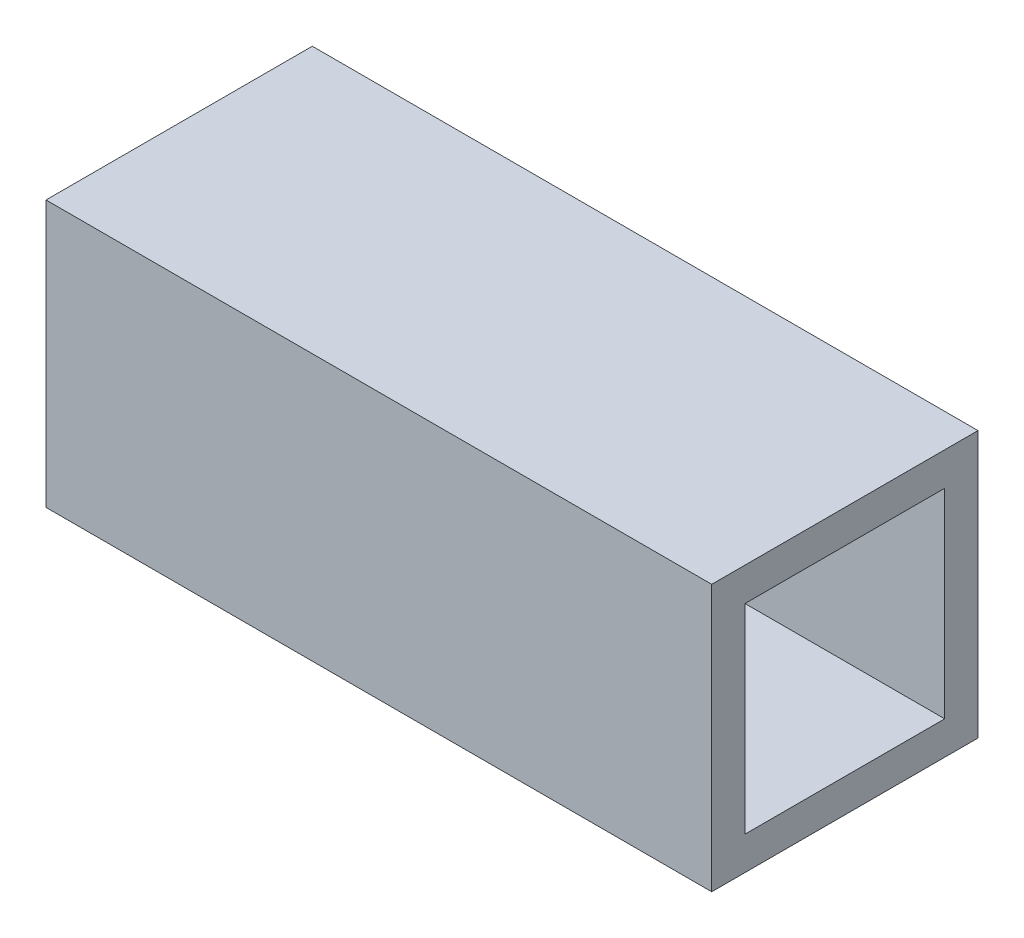
ISO-10303-21;
HEADER;
FILE_DESCRIPTION(('STEP AP214'),'2;1');
FILE_NAME('part.step','',(''),(''),'','','');
FILE_SCHEMA(('AUTOMOTIVE_DESIGN { 1 0 10303 214 1 1 1 1 }'));
ENDSEC;
DATA;
#1=APPLICATION_CONTEXT('core data for automotive mechanical design processes');
#2=APPLICATION_PROTOCOL_DEFINITION('international standard','automotive_design',2000,#1);
#3=PRODUCT_CONTEXT('',#1,'mechanical');
#4=PRODUCT('Part','Part','',(#3));
#5=PRODUCT_RELATED_PRODUCT_CATEGORY('part','',(#4));
#6=PRODUCT_DEFINITION_FORMATION('','',#4);
#7=PRODUCT_DEFINITION_CONTEXT('part definition',#1,'design');
#8=PRODUCT_DEFINITION('design','',#6,#7);
#9=PRODUCT_DEFINITION_SHAPE('','',#8);
#10=(LENGTH_UNIT() NAMED_UNIT(*) SI_UNIT(.MILLI.,.METRE.));
#11=(NAMED_UNIT(*) PLANE_ANGLE_UNIT() SI_UNIT($,.RADIAN.));
#12=(NAMED_UNIT(*) SI_UNIT($,.STERADIAN.) SOLID_ANGLE_UNIT());
#13=UNCERTAINTY_MEASURE_WITH_UNIT(LENGTH_MEASURE(1.E-05),#10,'distance_accuracy_value','');
#14=(GEOMETRIC_REPRESENTATION_CONTEXT(3) GLOBAL_UNCERTAINTY_ASSIGNED_CONTEXT((#13)) GLOBAL_UNIT_ASSIGNED_CONTEXT((#10,
#11,#12)) REPRESENTATION_CONTEXT('',''));
#15=CARTESIAN_POINT('',(0.,0.,0.));
#16=DIRECTION('',(0.,0.,1.));
#17=DIRECTION('',(1.,0.,0.));
#18=AXIS2_PLACEMENT_3D('',#15,#16,#17);
#19=CARTESIAN_POINT('',(0.,-19.05,-19.05));
#20=DIRECTION('',(0.,1.,0.));
#21=DIRECTION('',(0.,0.,1.));
#22=AXIS2_PLACEMENT_3D('',#19,#20,#21);
#23=PLANE('',#22);
#24=DIRECTION('',(0.,0.,-1.));
#25=VECTOR('',#24,1.);
#26=CARTESIAN_POINT('',(127.,-19.05,0.));
#27=LINE('',#26,#25);
#28=CARTESIAN_POINT('',(127.,-19.05,-19.05));
#29=VERTEX_POINT('',#28);
#30=CARTESIAN_POINT('',(127.,-19.05,19.05));
#31=VERTEX_POINT('',#30);
#32=EDGE_CURVE('E121',#29,#31,#27,.F.);
#33=ORIENTED_EDGE('',*,*,#32,.F.);
#34=DIRECTION('',(1.,0.,0.));
#35=VECTOR('',#34,1.);
#36=CARTESIAN_POINT('',(0.,-19.05,-19.05));
#37=LINE('',#36,#35);
#38=CARTESIAN_POINT('',(0.,-19.05,-19.05));
#39=VERTEX_POINT('',#38);
#40=EDGE_CURVE('E97',#39,#29,#37,.T.);
#41=ORIENTED_EDGE('',*,*,#40,.F.);
#42=DIRECTION('',(0.,0.,-1.));
#43=VECTOR('',#42,1.);
#44=CARTESIAN_POINT('',(0.,-19.05,0.));
#45=LINE('',#44,#43);
#46=CARTESIAN_POINT('',(0.,-19.05,19.05));
#47=VERTEX_POINT('',#46);
#48=EDGE_CURVE('E104',#39,#47,#45,.F.);
#49=ORIENTED_EDGE('',*,*,#48,.T.);
#50=DIRECTION('',(-1.,0.,0.));
#51=VECTOR('',#50,1.);
#52=CARTESIAN_POINT('',(0.,-19.05,19.05));
#53=LINE('',#52,#51);
#54=EDGE_CURVE('E19',#31,#47,#53,.T.);
#55=ORIENTED_EDGE('',*,*,#54,.F.);
#56=EDGE_LOOP('',(#33,#41,#49,#55));
#57=FACE_BOUND('',#56,.T.);
#58=ADVANCED_FACE('F16',(#57),#23,.T.);
#59=CARTESIAN_POINT('',(0.,-19.05,19.05));
#60=DIRECTION('',(0.,0.,-1.));
#61=DIRECTION('',(-1.,0.,0.));
#62=AXIS2_PLACEMENT_3D('',#59,#60,#61);
#63=PLANE('',#62);
#64=DIRECTION('',(0.,1.,0.));
#65=VECTOR('',#64,1.);
#66=CARTESIAN_POINT('',(127.,0.,19.05));
#67=LINE('',#66,#65);
#68=CARTESIAN_POINT('',(127.,19.05,19.05));
#69=VERTEX_POINT('',#68);
#70=EDGE_CURVE('E126',#31,#69,#67,.T.);
#71=ORIENTED_EDGE('',*,*,#70,.F.);
#72=ORIENTED_EDGE('',*,*,#54,.T.);
#73=DIRECTION('',(0.,1.,0.));
#74=VECTOR('',#73,1.);
#75=CARTESIAN_POINT('',(0.,0.,19.05));
#76=LINE('',#75,#74);
#77=CARTESIAN_POINT('',(0.,19.05,19.05));
#78=VERTEX_POINT('',#77);
#79=EDGE_CURVE('E80',#47,#78,#76,.T.);
#80=ORIENTED_EDGE('',*,*,#79,.T.);
#81=DIRECTION('',(1.,0.,0.));
#82=VECTOR('',#81,1.);
#83=CARTESIAN_POINT('',(0.,19.05,19.05));
#84=LINE('',#83,#82);
#85=EDGE_CURVE('E83',#69,#78,#84,.F.);
#86=ORIENTED_EDGE('',*,*,#85,.F.);
#87=EDGE_LOOP('',(#71,#72,#80,#86));
#88=FACE_BOUND('',#87,.T.);
#89=ADVANCED_FACE('F82',(#88),#63,.T.);
#90=CARTESIAN_POINT('',(0.,19.05,19.05));
#91=DIRECTION('',(0.,-1.,0.));
#92=DIRECTION('',(0.,0.,-1.));
#93=AXIS2_PLACEMENT_3D('',#90,#91,#92);
#94=PLANE('',#93);
#95=DIRECTION('',(0.,0.,-1.));
#96=VECTOR('',#95,1.);
#97=CARTESIAN_POINT('',(127.,19.05,0.));
#98=LINE('',#97,#96);
#99=CARTESIAN_POINT('',(127.,19.05,-19.05));
#100=VERTEX_POINT('',#99);
#101=EDGE_CURVE('E95',#69,#100,#98,.T.);
#102=ORIENTED_EDGE('',*,*,#101,.F.);
#103=ORIENTED_EDGE('',*,*,#85,.T.);
#104=DIRECTION('',(0.,0.,-1.));
#105=VECTOR('',#104,1.);
#106=CARTESIAN_POINT('',(0.,19.05,0.));
#107=LINE('',#106,#105);
#108=CARTESIAN_POINT('',(0.,19.05,-19.05));
#109=VERTEX_POINT('',#108);
#110=EDGE_CURVE('E88',#78,#109,#107,.T.);
#111=ORIENTED_EDGE('',*,*,#110,.T.);
#112=DIRECTION('',(1.,0.,0.));
#113=VECTOR('',#112,1.);
#114=CARTESIAN_POINT('',(0.,19.05,-19.05));
#115=LINE('',#114,#113);
#116=EDGE_CURVE('E109',#100,#109,#115,.F.);
#117=ORIENTED_EDGE('',*,*,#116,.F.);
#118=EDGE_LOOP('',(#102,#103,#111,#117));
#119=FACE_BOUND('',#118,.T.);
#120=ADVANCED_FACE('F92',(#119),#94,.T.);
#121=CARTESIAN_POINT('',(0.,19.05,-19.05));
#122=DIRECTION('',(0.,0.,1.));
#123=DIRECTION('',(1.,0.,0.));
#124=AXIS2_PLACEMENT_3D('',#121,#122,#123);
#125=PLANE('',#124);
#126=DIRECTION('',(0.,1.,0.));
#127=VECTOR('',#126,1.);
#128=CARTESIAN_POINT('',(127.,0.,-19.05));
#129=LINE('',#128,#127);
#130=EDGE_CURVE('E116',#100,#29,#129,.F.);
#131=ORIENTED_EDGE('',*,*,#130,.F.);
#132=ORIENTED_EDGE('',*,*,#116,.T.);
#133=DIRECTION('',(0.,1.,0.));
#134=VECTOR('',#133,1.);
#135=CARTESIAN_POINT('',(0.,0.,-19.05));
#136=LINE('',#135,#134);
#137=EDGE_CURVE('E102',#109,#39,#136,.F.);
#138=ORIENTED_EDGE('',*,*,#137,.T.);
#139=ORIENTED_EDGE('',*,*,#40,.T.);
#140=EDGE_LOOP('',(#131,#132,#138,#139));
#141=FACE_BOUND('',#140,.T.);
#142=ADVANCED_FACE('F115',(#141),#125,.T.);
#143=CARTESIAN_POINT('',(0.,-25.4,-25.4));
#144=DIRECTION('',(0.,0.,-1.));
#145=DIRECTION('',(-1.,0.,0.));
#146=AXIS2_PLACEMENT_3D('',#143,#144,#145);
#147=PLANE('',#146);
#148=DIRECTION('',(0.,1.,0.));
#149=VECTOR('',#148,1.);
#150=CARTESIAN_POINT('',(127.,0.,-25.4));
#151=LINE('',#150,#149);
#152=CARTESIAN_POINT('',(127.,-25.4,-25.4));
#153=VERTEX_POINT('',#152);
#154=CARTESIAN_POINT('',(127.,25.4,-25.4));
#155=VERTEX_POINT('',#154);
#156=EDGE_CURVE('E132',#153,#155,#151,.T.);
#157=ORIENTED_EDGE('',*,*,#156,.F.);
#158=DIRECTION('',(1.,0.,0.));
#159=VECTOR('',#158,1.);
#160=CARTESIAN_POINT('',(0.,-25.4,-25.4));
#161=LINE('',#160,#159);
#162=CARTESIAN_POINT('',(0.,-25.4,-25.4));
#163=VERTEX_POINT('',#162);
#164=EDGE_CURVE('E137',#163,#153,#161,.T.);
#165=ORIENTED_EDGE('',*,*,#164,.F.);
#166=DIRECTION('',(0.,1.,0.));
#167=VECTOR('',#166,1.);
#168=CARTESIAN_POINT('',(0.,0.,-25.4));
#169=LINE('',#168,#167);
#170=CARTESIAN_POINT('',(0.,25.4,-25.4));
#171=VERTEX_POINT('',#170);
#172=EDGE_CURVE('E89',#163,#171,#169,.T.);
#173=ORIENTED_EDGE('',*,*,#172,.T.);
#174=DIRECTION('',(1.,0.,0.));
#175=VECTOR('',#174,1.);
#176=CARTESIAN_POINT('',(0.,25.4,-25.4));
#177=LINE('',#176,#175);
#178=EDGE_CURVE('E240',#155,#171,#177,.F.);
#179=ORIENTED_EDGE('',*,*,#178,.F.);
#180=EDGE_LOOP('',(#157,#165,#173,#179));
#181=FACE_BOUND('',#180,.T.);
#182=ADVANCED_FACE('F166',(#181),#147,.T.);
#183=CARTESIAN_POINT('',(0.,0.,0.));
#184=DIRECTION('',(1.,0.,0.));
#185=DIRECTION('',(0.,0.,-1.));
#186=AXIS2_PLACEMENT_3D('',#183,#184,#185);
#187=PLANE('',#186);
#188=ORIENTED_EDGE('',*,*,#137,.F.);
#189=ORIENTED_EDGE('',*,*,#110,.F.);
#190=ORIENTED_EDGE('',*,*,#79,.F.);
#191=ORIENTED_EDGE('',*,*,#48,.F.);
#192=EDGE_LOOP('',(#188,#189,#190,#191));
#193=FACE_BOUND('',#192,.T.);
#194=DIRECTION('',(0.,0.,1.));
#195=VECTOR('',#194,1.);
#196=CARTESIAN_POINT('',(0.,25.4,-25.4));
#197=LINE('',#196,#195);
#198=CARTESIAN_POINT('',(0.,25.4,25.4));
#199=VERTEX_POINT('',#198);
#200=EDGE_CURVE('E122',#171,#199,#197,.T.);
#201=ORIENTED_EDGE('',*,*,#200,.F.);
#202=ORIENTED_EDGE('',*,*,#172,.F.);
#203=DIRECTION('',(0.,0.,-1.));
#204=VECTOR('',#203,1.);
#205=CARTESIAN_POINT('',(0.,-25.4,25.4));
#206=LINE('',#205,#204);
#207=CARTESIAN_POINT('',(0.,-25.4,25.4));
#208=VERTEX_POINT('',#207);
#209=EDGE_CURVE('E139',#208,#163,#206,.T.);
#210=ORIENTED_EDGE('',*,*,#209,.F.);
#211=DIRECTION('',(0.,1.,0.));
#212=VECTOR('',#211,1.);
#213=CARTESIAN_POINT('',(0.,25.4,25.4));
#214=LINE('',#213,#212);
#215=EDGE_CURVE('E246',#199,#208,#214,.F.);
#216=ORIENTED_EDGE('',*,*,#215,.F.);
#217=EDGE_LOOP('',(#201,#202,#210,#216));
#218=FACE_BOUND('',#217,.T.);
#219=ADVANCED_FACE('F99',(#193,#218),#187,.F.);
#220=CARTESIAN_POINT('',(0.,-25.4,25.4));
#221=DIRECTION('',(0.,-1.,0.));
#222=DIRECTION('',(0.,0.,-1.));
#223=AXIS2_PLACEMENT_3D('',#220,#221,#222);
#224=PLANE('',#223);
#225=DIRECTION('',(0.,0.,-1.));
#226=VECTOR('',#225,1.);
#227=CARTESIAN_POINT('',(127.,-25.4,0.));
#228=LINE('',#227,#226);
#229=CARTESIAN_POINT('',(127.,-25.4,25.4));
#230=VERTEX_POINT('',#229);
#231=EDGE_CURVE('E134',#230,#153,#228,.T.);
#232=ORIENTED_EDGE('',*,*,#231,.F.);
#233=DIRECTION('',(1.,0.,0.));
#234=VECTOR('',#233,1.);
#235=CARTESIAN_POINT('',(0.,-25.4,25.4));
#236=LINE('',#235,#234);
#237=EDGE_CURVE('E243',#208,#230,#236,.T.);
#238=ORIENTED_EDGE('',*,*,#237,.F.);
#239=ORIENTED_EDGE('',*,*,#209,.T.);
#240=ORIENTED_EDGE('',*,*,#164,.T.);
#241=EDGE_LOOP('',(#232,#238,#239,#240));
#242=FACE_BOUND('',#241,.T.);
#243=ADVANCED_FACE('F160',(#242),#224,.T.);
#244=CARTESIAN_POINT('',(127.,0.,0.));
#245=DIRECTION('',(1.,0.,0.));
#246=DIRECTION('',(0.,0.,-1.));
#247=AXIS2_PLACEMENT_3D('',#244,#245,#246);
#248=PLANE('',#247);
#249=ORIENTED_EDGE('',*,*,#101,.T.);
#250=ORIENTED_EDGE('',*,*,#130,.T.);
#251=ORIENTED_EDGE('',*,*,#32,.T.);
#252=ORIENTED_EDGE('',*,*,#70,.T.);
#253=EDGE_LOOP('',(#249,#250,#251,#252));
#254=FACE_BOUND('',#253,.T.);
#255=ORIENTED_EDGE('',*,*,#156,.T.);
#256=DIRECTION('',(0.,0.,1.));
#257=VECTOR('',#256,1.);
#258=CARTESIAN_POINT('',(127.,25.4,-25.4));
#259=LINE('',#258,#257);
#260=CARTESIAN_POINT('',(127.,25.4,25.4));
#261=VERTEX_POINT('',#260);
#262=EDGE_CURVE('E34',#261,#155,#259,.F.);
#263=ORIENTED_EDGE('',*,*,#262,.F.);
#264=DIRECTION('',(0.,1.,0.));
#265=VECTOR('',#264,1.);
#266=CARTESIAN_POINT('',(127.,25.4,25.4));
#267=LINE('',#266,#265);
#268=EDGE_CURVE('E25',#230,#261,#267,.T.);
#269=ORIENTED_EDGE('',*,*,#268,.F.);
#270=ORIENTED_EDGE('',*,*,#231,.T.);
#271=EDGE_LOOP('',(#255,#263,#269,#270));
#272=FACE_BOUND('',#271,.T.);
#273=ADVANCED_FACE('F120',(#254,#272),#248,.T.);
#274=CARTESIAN_POINT('',(0.,25.4,-25.4));
#275=DIRECTION('',(0.,1.,0.));
#276=DIRECTION('',(0.,0.,1.));
#277=AXIS2_PLACEMENT_3D('',#274,#275,#276);
#278=PLANE('',#277);
#279=ORIENTED_EDGE('',*,*,#262,.T.);
#280=ORIENTED_EDGE('',*,*,#178,.T.);
#281=ORIENTED_EDGE('',*,*,#200,.T.);
#282=DIRECTION('',(1.,0.,0.));
#283=VECTOR('',#282,1.);
#284=CARTESIAN_POINT('',(0.,25.4,25.4));
#285=LINE('',#284,#283);
#286=EDGE_CURVE('E11',#261,#199,#285,.F.);
#287=ORIENTED_EDGE('',*,*,#286,.F.);
#288=EDGE_LOOP('',(#279,#280,#281,#287));
#289=FACE_BOUND('',#288,.T.);
#290=ADVANCED_FACE('F148',(#289),#278,.T.);
#291=CARTESIAN_POINT('',(0.,25.4,25.4));
#292=DIRECTION('',(0.,0.,1.));
#293=DIRECTION('',(1.,0.,0.));
#294=AXIS2_PLACEMENT_3D('',#291,#292,#293);
#295=PLANE('',#294);
#296=ORIENTED_EDGE('',*,*,#268,.T.);
#297=ORIENTED_EDGE('',*,*,#286,.T.);
#298=ORIENTED_EDGE('',*,*,#215,.T.);
#299=ORIENTED_EDGE('',*,*,#237,.T.);
#300=EDGE_LOOP('',(#296,#297,#298,#299));
#301=FACE_BOUND('',#300,.T.);
#302=ADVANCED_FACE('F146',(#301),#295,.T.);
#303=CLOSED_SHELL('',(#58,#89,#120,#142,#182,#219,#243,#273,#290,#302));
#304=MANIFOLD_SOLID_BREP('B1',#303);
#305=ADVANCED_BREP_SHAPE_REPRESENTATION('',(#18,#304),#14);
#306=SHAPE_DEFINITION_REPRESENTATION(#9,#305);
ENDSEC;
END-ISO-10303-21;
